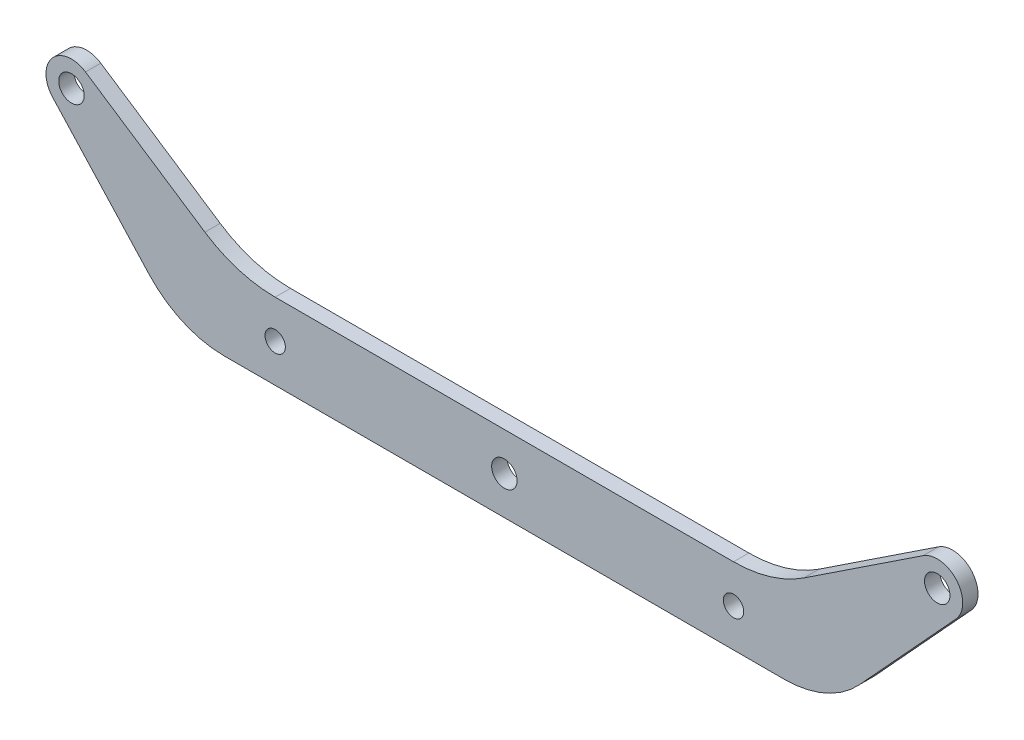
ISO-10303-21;
HEADER;
FILE_DESCRIPTION(('STEP AP214'),'2;1');
FILE_NAME('part.step','',(''),(''),'','','');
FILE_SCHEMA(('AUTOMOTIVE_DESIGN { 1 0 10303 214 1 1 1 1 }'));
ENDSEC;
DATA;
#1=APPLICATION_CONTEXT('core data for automotive mechanical design processes');
#2=APPLICATION_PROTOCOL_DEFINITION('international standard','automotive_design',2000,#1);
#3=PRODUCT_CONTEXT('',#1,'mechanical');
#4=PRODUCT('Part','Part','',(#3));
#5=PRODUCT_RELATED_PRODUCT_CATEGORY('part','',(#4));
#6=PRODUCT_DEFINITION_FORMATION('','',#4);
#7=PRODUCT_DEFINITION_CONTEXT('part definition',#1,'design');
#8=PRODUCT_DEFINITION('design','',#6,#7);
#9=PRODUCT_DEFINITION_SHAPE('','',#8);
#10=(LENGTH_UNIT() NAMED_UNIT(*) SI_UNIT(.MILLI.,.METRE.));
#11=(NAMED_UNIT(*) PLANE_ANGLE_UNIT() SI_UNIT($,.RADIAN.));
#12=(NAMED_UNIT(*) SI_UNIT($,.STERADIAN.) SOLID_ANGLE_UNIT());
#13=UNCERTAINTY_MEASURE_WITH_UNIT(LENGTH_MEASURE(1.E-05),#10,'distance_accuracy_value','');
#14=(GEOMETRIC_REPRESENTATION_CONTEXT(3) GLOBAL_UNCERTAINTY_ASSIGNED_CONTEXT((#13)) GLOBAL_UNIT_ASSIGNED_CONTEXT((#10,
#11,#12)) REPRESENTATION_CONTEXT('',''));
#15=CARTESIAN_POINT('',(0.,0.,0.));
#16=DIRECTION('',(0.,0.,1.));
#17=DIRECTION('',(1.,0.,0.));
#18=AXIS2_PLACEMENT_3D('',#15,#16,#17);
#19=CARTESIAN_POINT('',(23.1358370171919,-34.9528016415682,3.));
#20=DIRECTION('',(0.551954939718657,-0.83387393802671,0.));
#21=DIRECTION('',(0.833873938026711,0.551954939718657,0.));
#22=AXIS2_PLACEMENT_3D('',#19,#20,#21);
#23=PLANE('',#22);
#24=DIRECTION('',(-0.833873938026711,-0.551954939718657,0.));
#25=VECTOR('',#24,1.);
#26=CARTESIAN_POINT('',(23.1358370171919,-34.9528016415682,0.));
#27=LINE('',#26,#25);
#28=CARTESIAN_POINT('',(82.2402253014067,4.16936969013357,0.));
#29=VERTEX_POINT('',#28);
#30=CARTESIAN_POINT('',(58.7988734929664,-11.3468484506678,0.));
#31=VERTEX_POINT('',#30);
#32=EDGE_CURVE('E175',#29,#31,#27,.T.);
#33=ORIENTED_EDGE('',*,*,#32,.T.);
#34=DIRECTION('',(0.,0.,-1.));
#35=VECTOR('',#34,1.);
#36=CARTESIAN_POINT('',(58.7988734929664,-11.3468484506678,3.));
#37=LINE('',#36,#35);
#38=CARTESIAN_POINT('',(58.7988734929664,-11.3468484506678,3.));
#39=VERTEX_POINT('',#38);
#40=EDGE_CURVE('E11',#39,#31,#37,.T.);
#41=ORIENTED_EDGE('',*,*,#40,.F.);
#42=DIRECTION('',(-0.833873938026711,-0.551954939718657,0.));
#43=VECTOR('',#42,1.);
#44=CARTESIAN_POINT('',(23.1358370171919,-34.9528016415682,3.));
#45=LINE('',#44,#43);
#46=CARTESIAN_POINT('',(82.2402253014067,4.16936969013357,3.));
#47=VERTEX_POINT('',#46);
#48=EDGE_CURVE('E219',#47,#39,#45,.T.);
#49=ORIENTED_EDGE('',*,*,#48,.F.);
#50=DIRECTION('',(0.,0.,-1.));
#51=VECTOR('',#50,1.);
#52=CARTESIAN_POINT('',(82.2402253014067,4.16936969013357,3.));
#53=LINE('',#52,#51);
#54=EDGE_CURVE('E55',#47,#29,#53,.T.);
#55=ORIENTED_EDGE('',*,*,#54,.T.);
#56=EDGE_LOOP('',(#33,#41,#49,#55));
#57=FACE_BOUND('',#56,.T.);
#58=ADVANCED_FACE('F39',(#57),#23,.F.);
#59=CARTESIAN_POINT('',(45.,9.50000000000001,3.));
#60=DIRECTION('',(0.,0.,-1.));
#61=DIRECTION('',(-1.,0.,0.));
#62=AXIS2_PLACEMENT_3D('',#59,#60,#61);
#63=CYLINDRICAL_SURFACE('',#62,25.);
#64=CARTESIAN_POINT('',(45.,9.50000000000001,0.));
#65=DIRECTION('',(0.,0.,1.));
#66=DIRECTION('',(1.,0.,0.));
#67=AXIS2_PLACEMENT_3D('',#64,#65,#66);
#68=CIRCLE('',#67,25.);
#69=CARTESIAN_POINT('',(45.,-15.5,0.));
#70=VERTEX_POINT('',#69);
#71=EDGE_CURVE('E177',#31,#70,#68,.F.);
#72=ORIENTED_EDGE('',*,*,#71,.T.);
#73=DIRECTION('',(0.,0.,-1.));
#74=VECTOR('',#73,1.);
#75=CARTESIAN_POINT('',(45.,-15.5,3.));
#76=LINE('',#75,#74);
#77=CARTESIAN_POINT('',(45.,-15.5,3.));
#78=VERTEX_POINT('',#77);
#79=EDGE_CURVE('E47',#78,#70,#76,.T.);
#80=ORIENTED_EDGE('',*,*,#79,.F.);
#81=CARTESIAN_POINT('',(45.,9.50000000000001,3.));
#82=DIRECTION('',(0.,0.,1.));
#83=DIRECTION('',(1.,0.,0.));
#84=AXIS2_PLACEMENT_3D('',#81,#82,#83);
#85=CIRCLE('',#84,25.);
#86=EDGE_CURVE('E105',#39,#78,#85,.F.);
#87=ORIENTED_EDGE('',*,*,#86,.F.);
#88=ORIENTED_EDGE('',*,*,#40,.T.);
#89=EDGE_LOOP('',(#72,#80,#87,#88));
#90=FACE_BOUND('',#89,.T.);
#91=ADVANCED_FACE('F243',(#90),#63,.F.);
#92=CARTESIAN_POINT('',(0.,-15.5,3.));
#93=DIRECTION('',(0.,1.,0.));
#94=DIRECTION('',(-1.,0.,0.));
#95=AXIS2_PLACEMENT_3D('',#92,#93,#94);
#96=PLANE('',#95);
#97=DIRECTION('',(1.,0.,0.));
#98=VECTOR('',#97,1.);
#99=CARTESIAN_POINT('',(0.,-15.5,0.));
#100=LINE('',#99,#98);
#101=CARTESIAN_POINT('',(-45.,-15.5,0.));
#102=VERTEX_POINT('',#101);
#103=EDGE_CURVE('E180',#102,#70,#100,.T.);
#104=ORIENTED_EDGE('',*,*,#103,.F.);
#105=DIRECTION('',(0.,0.,-1.));
#106=VECTOR('',#105,1.);
#107=CARTESIAN_POINT('',(-45.,-15.5,3.));
#108=LINE('',#107,#106);
#109=CARTESIAN_POINT('',(-45.,-15.5,3.));
#110=VERTEX_POINT('',#109);
#111=EDGE_CURVE('E236',#110,#102,#108,.T.);
#112=ORIENTED_EDGE('',*,*,#111,.F.);
#113=DIRECTION('',(1.,0.,0.));
#114=VECTOR('',#113,1.);
#115=CARTESIAN_POINT('',(0.,-15.5,3.));
#116=LINE('',#115,#114);
#117=EDGE_CURVE('E242',#110,#78,#116,.T.);
#118=ORIENTED_EDGE('',*,*,#117,.T.);
#119=ORIENTED_EDGE('',*,*,#79,.T.);
#120=EDGE_LOOP('',(#104,#112,#118,#119));
#121=FACE_BOUND('',#120,.T.);
#122=ADVANCED_FACE('F240',(#121),#96,.T.);
#123=CARTESIAN_POINT('',(-45.,9.49999999999999,3.));
#124=DIRECTION('',(0.,0.,-1.));
#125=DIRECTION('',(-1.,0.,0.));
#126=AXIS2_PLACEMENT_3D('',#123,#124,#125);
#127=CYLINDRICAL_SURFACE('',#126,25.);
#128=CARTESIAN_POINT('',(-45.,9.49999999999999,0.));
#129=DIRECTION('',(0.,0.,1.));
#130=DIRECTION('',(1.,0.,0.));
#131=AXIS2_PLACEMENT_3D('',#128,#129,#130);
#132=CIRCLE('',#131,25.);
#133=CARTESIAN_POINT('',(-58.7988734929664,-11.3468484506678,0.));
#134=VERTEX_POINT('',#133);
#135=EDGE_CURVE('E183',#134,#102,#132,.T.);
#136=ORIENTED_EDGE('',*,*,#135,.F.);
#137=DIRECTION('',(0.,0.,-1.));
#138=VECTOR('',#137,1.);
#139=CARTESIAN_POINT('',(-58.7988734929664,-11.3468484506678,3.));
#140=LINE('',#139,#138);
#141=CARTESIAN_POINT('',(-58.7988734929664,-11.3468484506678,3.));
#142=VERTEX_POINT('',#141);
#143=EDGE_CURVE('E234',#142,#134,#140,.T.);
#144=ORIENTED_EDGE('',*,*,#143,.F.);
#145=CARTESIAN_POINT('',(-45.,9.49999999999999,3.));
#146=DIRECTION('',(0.,0.,1.));
#147=DIRECTION('',(1.,0.,0.));
#148=AXIS2_PLACEMENT_3D('',#145,#146,#147);
#149=CIRCLE('',#148,25.);
#150=EDGE_CURVE('E255',#142,#110,#149,.T.);
#151=ORIENTED_EDGE('',*,*,#150,.T.);
#152=ORIENTED_EDGE('',*,*,#111,.T.);
#153=EDGE_LOOP('',(#136,#144,#151,#152));
#154=FACE_BOUND('',#153,.T.);
#155=ADVANCED_FACE('F252',(#154),#127,.F.);
#156=CARTESIAN_POINT('',(-23.1358370171919,-34.9528016415682,3.));
#157=DIRECTION('',(0.551954939718656,0.833873938026711,0.));
#158=DIRECTION('',(-0.833873938026711,0.551954939718656,0.));
#159=AXIS2_PLACEMENT_3D('',#156,#157,#158);
#160=PLANE('',#159);
#161=DIRECTION('',(0.833873938026711,-0.551954939718656,0.));
#162=VECTOR('',#161,1.);
#163=CARTESIAN_POINT('',(-23.1358370171919,-34.9528016415682,0.));
#164=LINE('',#163,#162);
#165=CARTESIAN_POINT('',(-82.2402253014067,4.16936969013355,0.));
#166=VERTEX_POINT('',#165);
#167=EDGE_CURVE('E186',#166,#134,#164,.T.);
#168=ORIENTED_EDGE('',*,*,#167,.F.);
#169=DIRECTION('',(0.,0.,-1.));
#170=VECTOR('',#169,1.);
#171=CARTESIAN_POINT('',(-82.2402253014067,4.16936969013355,3.));
#172=LINE('',#171,#170);
#173=CARTESIAN_POINT('',(-82.2402253014067,4.16936969013355,3.));
#174=VERTEX_POINT('',#173);
#175=EDGE_CURVE('E232',#174,#166,#172,.T.);
#176=ORIENTED_EDGE('',*,*,#175,.F.);
#177=DIRECTION('',(0.833873938026711,-0.551954939718656,0.));
#178=VECTOR('',#177,1.);
#179=CARTESIAN_POINT('',(-23.1358370171919,-34.9528016415682,3.));
#180=LINE('',#179,#178);
#181=EDGE_CURVE('E259',#174,#142,#180,.T.);
#182=ORIENTED_EDGE('',*,*,#181,.T.);
#183=ORIENTED_EDGE('',*,*,#143,.T.);
#184=EDGE_LOOP('',(#168,#176,#182,#183));
#185=FACE_BOUND('',#184,.T.);
#186=ADVANCED_FACE('F306',(#185),#160,.T.);
#187=CARTESIAN_POINT('',(-85.,0.,3.));
#188=DIRECTION('',(0.,0.,-1.));
#189=DIRECTION('',(-1.,0.,0.));
#190=AXIS2_PLACEMENT_3D('',#187,#188,#189);
#191=CYLINDRICAL_SURFACE('',#190,5.);
#192=CARTESIAN_POINT('',(-85.,0.,0.));
#193=DIRECTION('',(0.,0.,1.));
#194=DIRECTION('',(1.,0.,0.));
#195=AXIS2_PLACEMENT_3D('',#192,#193,#194);
#196=CIRCLE('',#195,5.);
#197=CARTESIAN_POINT('',(-88.683416390266,-3.38118968647425,0.));
#198=VERTEX_POINT('',#197);
#199=EDGE_CURVE('E189',#166,#198,#196,.T.);
#200=ORIENTED_EDGE('',*,*,#199,.T.);
#201=DIRECTION('',(0.,0.,-1.));
#202=VECTOR('',#201,1.);
#203=CARTESIAN_POINT('',(-88.683416390266,-3.38118968647425,3.));
#204=LINE('',#203,#202);
#205=CARTESIAN_POINT('',(-88.683416390266,-3.38118968647425,3.));
#206=VERTEX_POINT('',#205);
#207=EDGE_CURVE('E229',#206,#198,#204,.T.);
#208=ORIENTED_EDGE('',*,*,#207,.F.);
#209=CARTESIAN_POINT('',(-85.,0.,3.));
#210=DIRECTION('',(0.,0.,1.));
#211=DIRECTION('',(1.,0.,0.));
#212=AXIS2_PLACEMENT_3D('',#209,#210,#211);
#213=CIRCLE('',#212,5.);
#214=EDGE_CURVE('E265',#174,#206,#213,.T.);
#215=ORIENTED_EDGE('',*,*,#214,.F.);
#216=ORIENTED_EDGE('',*,*,#175,.T.);
#217=EDGE_LOOP('',(#200,#208,#215,#216));
#218=FACE_BOUND('',#217,.T.);
#219=ADVANCED_FACE('F309',(#218),#191,.T.);
#220=CARTESIAN_POINT('',(-49.8131078241384,-45.7259100196501,3.));
#221=DIRECTION('',(0.736683278053198,0.676237937294851,0.));
#222=DIRECTION('',(-0.676237937294851,0.736683278053198,0.));
#223=AXIS2_PLACEMENT_3D('',#220,#221,#222);
#224=PLANE('',#223);
#225=DIRECTION('',(0.676237937294851,-0.736683278053198,0.));
#226=VECTOR('',#225,1.);
#227=CARTESIAN_POINT('',(-49.8131078241384,-45.7259100196501,0.));
#228=LINE('',#227,#226);
#229=CARTESIAN_POINT('',(-69.7336655610639,-24.024758745897,0.));
#230=VERTEX_POINT('',#229);
#231=EDGE_CURVE('E191',#198,#230,#228,.T.);
#232=ORIENTED_EDGE('',*,*,#231,.T.);
#233=DIRECTION('',(0.,0.,-1.));
#234=VECTOR('',#233,1.);
#235=CARTESIAN_POINT('',(-69.7336655610639,-24.024758745897,3.));
#236=LINE('',#235,#234);
#237=CARTESIAN_POINT('',(-69.7336655610639,-24.024758745897,3.));
#238=VERTEX_POINT('',#237);
#239=EDGE_CURVE('E226',#238,#230,#236,.T.);
#240=ORIENTED_EDGE('',*,*,#239,.F.);
#241=DIRECTION('',(0.676237937294851,-0.736683278053198,0.));
#242=VECTOR('',#241,1.);
#243=CARTESIAN_POINT('',(-49.8131078241384,-45.7259100196501,3.));
#244=LINE('',#243,#242);
#245=EDGE_CURVE('E267',#206,#238,#244,.T.);
#246=ORIENTED_EDGE('',*,*,#245,.F.);
#247=ORIENTED_EDGE('',*,*,#207,.T.);
#248=EDGE_LOOP('',(#232,#240,#246,#247));
#249=FACE_BOUND('',#248,.T.);
#250=ADVANCED_FACE('F313',(#249),#224,.F.);
#251=CARTESIAN_POINT('',(-55.,-10.5,3.));
#252=DIRECTION('',(0.,0.,-1.));
#253=DIRECTION('',(-1.,0.,0.));
#254=AXIS2_PLACEMENT_3D('',#251,#252,#253);
#255=CYLINDRICAL_SURFACE('',#254,20.);
#256=CARTESIAN_POINT('',(-55.,-10.5,0.));
#257=DIRECTION('',(0.,0.,1.));
#258=DIRECTION('',(1.,0.,0.));
#259=AXIS2_PLACEMENT_3D('',#256,#257,#258);
#260=CIRCLE('',#259,20.);
#261=CARTESIAN_POINT('',(-55.,-30.5,0.));
#262=VERTEX_POINT('',#261);
#263=EDGE_CURVE('E193',#230,#262,#260,.T.);
#264=ORIENTED_EDGE('',*,*,#263,.T.);
#265=DIRECTION('',(0.,0.,-1.));
#266=VECTOR('',#265,1.);
#267=CARTESIAN_POINT('',(-55.,-30.5,3.));
#268=LINE('',#267,#266);
#269=CARTESIAN_POINT('',(-55.,-30.5,3.));
#270=VERTEX_POINT('',#269);
#271=EDGE_CURVE('E223',#270,#262,#268,.T.);
#272=ORIENTED_EDGE('',*,*,#271,.F.);
#273=CARTESIAN_POINT('',(-55.,-10.5,3.));
#274=DIRECTION('',(0.,0.,1.));
#275=DIRECTION('',(1.,0.,0.));
#276=AXIS2_PLACEMENT_3D('',#273,#274,#275);
#277=CIRCLE('',#276,20.);
#278=EDGE_CURVE('E269',#238,#270,#277,.T.);
#279=ORIENTED_EDGE('',*,*,#278,.F.);
#280=ORIENTED_EDGE('',*,*,#239,.T.);
#281=EDGE_LOOP('',(#264,#272,#279,#280));
#282=FACE_BOUND('',#281,.T.);
#283=ADVANCED_FACE('F275',(#282),#255,.T.);
#284=CARTESIAN_POINT('',(0.,-30.5,3.));
#285=DIRECTION('',(0.,1.,0.));
#286=DIRECTION('',(0.,0.,1.));
#287=AXIS2_PLACEMENT_3D('',#284,#285,#286);
#288=PLANE('',#287);
#289=DIRECTION('',(1.,0.,0.));
#290=VECTOR('',#289,1.);
#291=CARTESIAN_POINT('',(0.,-30.5,0.));
#292=LINE('',#291,#290);
#293=CARTESIAN_POINT('',(55.,-30.5,0.));
#294=VERTEX_POINT('',#293);
#295=EDGE_CURVE('E195',#262,#294,#292,.T.);
#296=ORIENTED_EDGE('',*,*,#295,.T.);
#297=DIRECTION('',(0.,0.,-1.));
#298=VECTOR('',#297,1.);
#299=CARTESIAN_POINT('',(55.,-30.5,3.));
#300=LINE('',#299,#298);
#301=CARTESIAN_POINT('',(55.,-30.5,3.));
#302=VERTEX_POINT('',#301);
#303=EDGE_CURVE('E142',#302,#294,#300,.T.);
#304=ORIENTED_EDGE('',*,*,#303,.F.);
#305=DIRECTION('',(1.,0.,0.));
#306=VECTOR('',#305,1.);
#307=CARTESIAN_POINT('',(0.,-30.5,3.));
#308=LINE('',#307,#306);
#309=EDGE_CURVE('E151',#270,#302,#308,.T.);
#310=ORIENTED_EDGE('',*,*,#309,.F.);
#311=ORIENTED_EDGE('',*,*,#271,.T.);
#312=EDGE_LOOP('',(#296,#304,#310,#311));
#313=FACE_BOUND('',#312,.T.);
#314=ADVANCED_FACE('F279',(#313),#288,.F.);
#315=CARTESIAN_POINT('',(55.,-10.5,3.));
#316=DIRECTION('',(0.,0.,-1.));
#317=DIRECTION('',(-1.,0.,0.));
#318=AXIS2_PLACEMENT_3D('',#315,#316,#317);
#319=CYLINDRICAL_SURFACE('',#318,20.);
#320=CARTESIAN_POINT('',(55.,-10.5,0.));
#321=DIRECTION('',(0.,0.,1.));
#322=DIRECTION('',(1.,0.,0.));
#323=AXIS2_PLACEMENT_3D('',#320,#321,#322);
#324=CIRCLE('',#323,20.);
#325=CARTESIAN_POINT('',(69.733665561064,-24.024758745897,0.));
#326=VERTEX_POINT('',#325);
#327=EDGE_CURVE('E138',#326,#294,#324,.F.);
#328=ORIENTED_EDGE('',*,*,#327,.F.);
#329=DIRECTION('',(0.,0.,-1.));
#330=VECTOR('',#329,1.);
#331=CARTESIAN_POINT('',(69.733665561064,-24.024758745897,3.));
#332=LINE('',#331,#330);
#333=CARTESIAN_POINT('',(69.733665561064,-24.024758745897,3.));
#334=VERTEX_POINT('',#333);
#335=EDGE_CURVE('E133',#334,#326,#332,.T.);
#336=ORIENTED_EDGE('',*,*,#335,.F.);
#337=CARTESIAN_POINT('',(55.,-10.5,3.));
#338=DIRECTION('',(0.,0.,1.));
#339=DIRECTION('',(1.,0.,0.));
#340=AXIS2_PLACEMENT_3D('',#337,#338,#339);
#341=CIRCLE('',#340,20.);
#342=EDGE_CURVE('E136',#334,#302,#341,.F.);
#343=ORIENTED_EDGE('',*,*,#342,.T.);
#344=ORIENTED_EDGE('',*,*,#303,.T.);
#345=EDGE_LOOP('',(#328,#336,#343,#344));
#346=FACE_BOUND('',#345,.T.);
#347=ADVANCED_FACE('F135',(#346),#319,.T.);
#348=CARTESIAN_POINT('',(49.8131078241385,-45.7259100196501,3.));
#349=DIRECTION('',(0.736683278053198,-0.676237937294851,0.));
#350=DIRECTION('',(0.676237937294851,0.736683278053198,0.));
#351=AXIS2_PLACEMENT_3D('',#348,#349,#350);
#352=PLANE('',#351);
#353=DIRECTION('',(-0.676237937294851,-0.736683278053198,0.));
#354=VECTOR('',#353,1.);
#355=CARTESIAN_POINT('',(49.8131078241385,-45.7259100196501,0.));
#356=LINE('',#355,#354);
#357=CARTESIAN_POINT('',(88.683416390266,-3.38118968647423,0.));
#358=VERTEX_POINT('',#357);
#359=EDGE_CURVE('E199',#358,#326,#356,.T.);
#360=ORIENTED_EDGE('',*,*,#359,.F.);
#361=DIRECTION('',(0.,0.,-1.));
#362=VECTOR('',#361,1.);
#363=CARTESIAN_POINT('',(88.683416390266,-3.38118968647423,3.));
#364=LINE('',#363,#362);
#365=CARTESIAN_POINT('',(88.683416390266,-3.38118968647423,3.));
#366=VERTEX_POINT('',#365);
#367=EDGE_CURVE('E93',#366,#358,#364,.T.);
#368=ORIENTED_EDGE('',*,*,#367,.F.);
#369=DIRECTION('',(-0.676237937294851,-0.736683278053198,0.));
#370=VECTOR('',#369,1.);
#371=CARTESIAN_POINT('',(49.8131078241385,-45.7259100196501,3.));
#372=LINE('',#371,#370);
#373=EDGE_CURVE('E149',#366,#334,#372,.T.);
#374=ORIENTED_EDGE('',*,*,#373,.T.);
#375=ORIENTED_EDGE('',*,*,#335,.T.);
#376=EDGE_LOOP('',(#360,#368,#374,#375));
#377=FACE_BOUND('',#376,.T.);
#378=ADVANCED_FACE('F154',(#377),#352,.T.);
#379=CARTESIAN_POINT('',(-45.,-23.,3.));
#380=DIRECTION('',(0.,0.,-1.));
#381=DIRECTION('',(-1.,0.,0.));
#382=AXIS2_PLACEMENT_3D('',#379,#380,#381);
#383=CYLINDRICAL_SURFACE('',#382,2.);
#384=CARTESIAN_POINT('',(-45.,-23.,3.));
#385=DIRECTION('',(0.,0.,1.));
#386=DIRECTION('',(1.,0.,0.));
#387=AXIS2_PLACEMENT_3D('',#384,#385,#386);
#388=CIRCLE('',#387,2.);
#389=CARTESIAN_POINT('',(-43.,-23.,3.));
#390=VERTEX_POINT('',#389);
#391=EDGE_CURVE('E169',#390,#390,#388,.T.);
#392=ORIENTED_EDGE('',*,*,#391,.T.);
#393=EDGE_LOOP('',(#392));
#394=FACE_BOUND('',#393,.T.);
#395=CARTESIAN_POINT('',(-45.,-23.,0.));
#396=DIRECTION('',(0.,0.,1.));
#397=DIRECTION('',(1.,0.,0.));
#398=AXIS2_PLACEMENT_3D('',#395,#396,#397);
#399=CIRCLE('',#398,2.);
#400=CARTESIAN_POINT('',(-43.,-23.,0.));
#401=VERTEX_POINT('',#400);
#402=EDGE_CURVE('E213',#401,#401,#399,.T.);
#403=ORIENTED_EDGE('',*,*,#402,.F.);
#404=EDGE_LOOP('',(#403));
#405=FACE_BOUND('',#404,.T.);
#406=ADVANCED_FACE('F324',(#394,#405),#383,.F.);
#407=CARTESIAN_POINT('',(0.,-23.,3.));
#408=DIRECTION('',(0.,0.,-1.));
#409=DIRECTION('',(-1.,0.,0.));
#410=AXIS2_PLACEMENT_3D('',#407,#408,#409);
#411=CYLINDRICAL_SURFACE('',#410,2.5);
#412=CARTESIAN_POINT('',(0.,-23.,3.));
#413=DIRECTION('',(0.,0.,1.));
#414=DIRECTION('',(1.,0.,0.));
#415=AXIS2_PLACEMENT_3D('',#412,#413,#414);
#416=CIRCLE('',#415,2.5);
#417=CARTESIAN_POINT('',(2.50000000000001,-23.,3.));
#418=VERTEX_POINT('',#417);
#419=EDGE_CURVE('E166',#418,#418,#416,.T.);
#420=ORIENTED_EDGE('',*,*,#419,.T.);
#421=EDGE_LOOP('',(#420));
#422=FACE_BOUND('',#421,.T.);
#423=CARTESIAN_POINT('',(0.,-23.,0.));
#424=DIRECTION('',(0.,0.,1.));
#425=DIRECTION('',(1.,0.,0.));
#426=AXIS2_PLACEMENT_3D('',#423,#424,#425);
#427=CIRCLE('',#426,2.5);
#428=CARTESIAN_POINT('',(2.50000000000001,-23.,0.));
#429=VERTEX_POINT('',#428);
#430=EDGE_CURVE('E210',#429,#429,#427,.T.);
#431=ORIENTED_EDGE('',*,*,#430,.F.);
#432=EDGE_LOOP('',(#431));
#433=FACE_BOUND('',#432,.T.);
#434=ADVANCED_FACE('F328',(#422,#433),#411,.F.);
#435=CARTESIAN_POINT('',(85.,0.,3.));
#436=DIRECTION('',(0.,0.,-1.));
#437=DIRECTION('',(-1.,0.,0.));
#438=AXIS2_PLACEMENT_3D('',#435,#436,#437);
#439=CYLINDRICAL_SURFACE('',#438,2.50000000000001);
#440=CARTESIAN_POINT('',(85.,0.,3.));
#441=DIRECTION('',(0.,0.,1.));
#442=DIRECTION('',(1.,0.,0.));
#443=AXIS2_PLACEMENT_3D('',#440,#441,#442);
#444=CIRCLE('',#443,2.50000000000001);
#445=CARTESIAN_POINT('',(87.5,0.,3.));
#446=VERTEX_POINT('',#445);
#447=EDGE_CURVE('E163',#446,#446,#444,.F.);
#448=ORIENTED_EDGE('',*,*,#447,.F.);
#449=EDGE_LOOP('',(#448));
#450=FACE_BOUND('',#449,.T.);
#451=CARTESIAN_POINT('',(85.,0.,0.));
#452=DIRECTION('',(0.,0.,1.));
#453=DIRECTION('',(1.,0.,0.));
#454=AXIS2_PLACEMENT_3D('',#451,#452,#453);
#455=CIRCLE('',#454,2.50000000000001);
#456=CARTESIAN_POINT('',(87.5,0.,0.));
#457=VERTEX_POINT('',#456);
#458=EDGE_CURVE('E207',#457,#457,#455,.F.);
#459=ORIENTED_EDGE('',*,*,#458,.T.);
#460=EDGE_LOOP('',(#459));
#461=FACE_BOUND('',#460,.T.);
#462=ADVANCED_FACE('F291',(#450,#461),#439,.F.);
#463=CARTESIAN_POINT('',(-85.,0.,3.));
#464=DIRECTION('',(0.,0.,-1.));
#465=DIRECTION('',(-1.,0.,0.));
#466=AXIS2_PLACEMENT_3D('',#463,#464,#465);
#467=CYLINDRICAL_SURFACE('',#466,2.50000000000001);
#468=CARTESIAN_POINT('',(-85.,0.,3.));
#469=DIRECTION('',(0.,0.,1.));
#470=DIRECTION('',(1.,0.,0.));
#471=AXIS2_PLACEMENT_3D('',#468,#469,#470);
#472=CIRCLE('',#471,2.50000000000001);
#473=CARTESIAN_POINT('',(-82.5,0.,3.));
#474=VERTEX_POINT('',#473);
#475=EDGE_CURVE('E157',#474,#474,#472,.T.);
#476=ORIENTED_EDGE('',*,*,#475,.T.);
#477=EDGE_LOOP('',(#476));
#478=FACE_BOUND('',#477,.T.);
#479=CARTESIAN_POINT('',(-85.,0.,0.));
#480=DIRECTION('',(0.,0.,1.));
#481=DIRECTION('',(1.,0.,0.));
#482=AXIS2_PLACEMENT_3D('',#479,#480,#481);
#483=CIRCLE('',#482,2.50000000000001);
#484=CARTESIAN_POINT('',(-82.5,0.,0.));
#485=VERTEX_POINT('',#484);
#486=EDGE_CURVE('E204',#485,#485,#483,.T.);
#487=ORIENTED_EDGE('',*,*,#486,.F.);
#488=EDGE_LOOP('',(#487));
#489=FACE_BOUND('',#488,.T.);
#490=ADVANCED_FACE('F283',(#478,#489),#467,.F.);
#491=CARTESIAN_POINT('',(85.,0.,3.));
#492=DIRECTION('',(0.,0.,-1.));
#493=DIRECTION('',(-1.,0.,0.));
#494=AXIS2_PLACEMENT_3D('',#491,#492,#493);
#495=CYLINDRICAL_SURFACE('',#494,5.00000000000001);
#496=CARTESIAN_POINT('',(85.,0.,0.));
#497=DIRECTION('',(0.,0.,1.));
#498=DIRECTION('',(1.,0.,0.));
#499=AXIS2_PLACEMENT_3D('',#496,#497,#498);
#500=CIRCLE('',#499,5.00000000000001);
#501=EDGE_CURVE('E201',#29,#358,#500,.F.);
#502=ORIENTED_EDGE('',*,*,#501,.F.);
#503=ORIENTED_EDGE('',*,*,#54,.F.);
#504=CARTESIAN_POINT('',(85.,0.,3.));
#505=DIRECTION('',(0.,0.,1.));
#506=DIRECTION('',(1.,0.,0.));
#507=AXIS2_PLACEMENT_3D('',#504,#505,#506);
#508=CIRCLE('',#507,5.00000000000001);
#509=EDGE_CURVE('E155',#47,#366,#508,.F.);
#510=ORIENTED_EDGE('',*,*,#509,.T.);
#511=ORIENTED_EDGE('',*,*,#367,.T.);
#512=EDGE_LOOP('',(#502,#503,#510,#511));
#513=FACE_BOUND('',#512,.T.);
#514=ADVANCED_FACE('F280',(#513),#495,.T.);
#515=CARTESIAN_POINT('',(45.,-23.,3.));
#516=DIRECTION('',(0.,0.,-1.));
#517=DIRECTION('',(-1.,0.,0.));
#518=AXIS2_PLACEMENT_3D('',#515,#516,#517);
#519=CYLINDRICAL_SURFACE('',#518,2.);
#520=CARTESIAN_POINT('',(45.,-23.,3.));
#521=DIRECTION('',(0.,0.,1.));
#522=DIRECTION('',(1.,0.,0.));
#523=AXIS2_PLACEMENT_3D('',#520,#521,#522);
#524=CIRCLE('',#523,2.);
#525=CARTESIAN_POINT('',(47.,-23.,3.));
#526=VERTEX_POINT('',#525);
#527=EDGE_CURVE('E172',#526,#526,#524,.F.);
#528=ORIENTED_EDGE('',*,*,#527,.F.);
#529=EDGE_LOOP('',(#528));
#530=FACE_BOUND('',#529,.T.);
#531=CARTESIAN_POINT('',(45.,-23.,0.));
#532=DIRECTION('',(0.,0.,1.));
#533=DIRECTION('',(1.,0.,0.));
#534=AXIS2_PLACEMENT_3D('',#531,#532,#533);
#535=CIRCLE('',#534,2.);
#536=CARTESIAN_POINT('',(47.,-23.,0.));
#537=VERTEX_POINT('',#536);
#538=EDGE_CURVE('E216',#537,#537,#535,.F.);
#539=ORIENTED_EDGE('',*,*,#538,.T.);
#540=EDGE_LOOP('',(#539));
#541=FACE_BOUND('',#540,.T.);
#542=ADVANCED_FACE('F282',(#530,#541),#519,.F.);
#543=CARTESIAN_POINT('',(0.,0.,3.));
#544=DIRECTION('',(0.,0.,1.));
#545=DIRECTION('',(1.,0.,0.));
#546=AXIS2_PLACEMENT_3D('',#543,#544,#545);
#547=PLANE('',#546);
#548=ORIENTED_EDGE('',*,*,#48,.T.);
#549=ORIENTED_EDGE('',*,*,#86,.T.);
#550=ORIENTED_EDGE('',*,*,#117,.F.);
#551=ORIENTED_EDGE('',*,*,#150,.F.);
#552=ORIENTED_EDGE('',*,*,#181,.F.);
#553=ORIENTED_EDGE('',*,*,#214,.T.);
#554=ORIENTED_EDGE('',*,*,#245,.T.);
#555=ORIENTED_EDGE('',*,*,#278,.T.);
#556=ORIENTED_EDGE('',*,*,#309,.T.);
#557=ORIENTED_EDGE('',*,*,#342,.F.);
#558=ORIENTED_EDGE('',*,*,#373,.F.);
#559=ORIENTED_EDGE('',*,*,#509,.F.);
#560=EDGE_LOOP('',(#548,#549,#550,#551,#552,#553,#554,#555,#556,#557,#558,#559));
#561=FACE_BOUND('',#560,.T.);
#562=ORIENTED_EDGE('',*,*,#475,.F.);
#563=EDGE_LOOP('',(#562));
#564=FACE_BOUND('',#563,.T.);
#565=ORIENTED_EDGE('',*,*,#447,.T.);
#566=EDGE_LOOP('',(#565));
#567=FACE_BOUND('',#566,.T.);
#568=ORIENTED_EDGE('',*,*,#419,.F.);
#569=EDGE_LOOP('',(#568));
#570=FACE_BOUND('',#569,.T.);
#571=ORIENTED_EDGE('',*,*,#391,.F.);
#572=EDGE_LOOP('',(#571));
#573=FACE_BOUND('',#572,.T.);
#574=ORIENTED_EDGE('',*,*,#527,.T.);
#575=EDGE_LOOP('',(#574));
#576=FACE_BOUND('',#575,.T.);
#577=ADVANCED_FACE('F146',(#561,#564,#567,#570,#573,#576),#547,.T.);
#578=CARTESIAN_POINT('',(0.,0.,0.));
#579=DIRECTION('',(0.,0.,1.));
#580=DIRECTION('',(1.,0.,0.));
#581=AXIS2_PLACEMENT_3D('',#578,#579,#580);
#582=PLANE('',#581);
#583=ORIENTED_EDGE('',*,*,#32,.F.);
#584=ORIENTED_EDGE('',*,*,#501,.T.);
#585=ORIENTED_EDGE('',*,*,#359,.T.);
#586=ORIENTED_EDGE('',*,*,#327,.T.);
#587=ORIENTED_EDGE('',*,*,#295,.F.);
#588=ORIENTED_EDGE('',*,*,#263,.F.);
#589=ORIENTED_EDGE('',*,*,#231,.F.);
#590=ORIENTED_EDGE('',*,*,#199,.F.);
#591=ORIENTED_EDGE('',*,*,#167,.T.);
#592=ORIENTED_EDGE('',*,*,#135,.T.);
#593=ORIENTED_EDGE('',*,*,#103,.T.);
#594=ORIENTED_EDGE('',*,*,#71,.F.);
#595=EDGE_LOOP('',(#583,#584,#585,#586,#587,#588,#589,#590,#591,#592,#593,#594));
#596=FACE_BOUND('',#595,.T.);
#597=ORIENTED_EDGE('',*,*,#486,.T.);
#598=EDGE_LOOP('',(#597));
#599=FACE_BOUND('',#598,.T.);
#600=ORIENTED_EDGE('',*,*,#458,.F.);
#601=EDGE_LOOP('',(#600));
#602=FACE_BOUND('',#601,.T.);
#603=ORIENTED_EDGE('',*,*,#430,.T.);
#604=EDGE_LOOP('',(#603));
#605=FACE_BOUND('',#604,.T.);
#606=ORIENTED_EDGE('',*,*,#402,.T.);
#607=EDGE_LOOP('',(#606));
#608=FACE_BOUND('',#607,.T.);
#609=ORIENTED_EDGE('',*,*,#538,.F.);
#610=EDGE_LOOP('',(#609));
#611=FACE_BOUND('',#610,.T.);
#612=ADVANCED_FACE('F246',(#596,#599,#602,#605,#608,#611),#582,.F.);
#613=CLOSED_SHELL('',(#58,#91,#122,#155,#186,#219,#250,#283,#314,#347,#378,#406,#434,#462,#490,
#514,#542,#577,#612));
#614=MANIFOLD_SOLID_BREP('B2',#613);
#615=ADVANCED_BREP_SHAPE_REPRESENTATION('',(#18,#614),#14);
#616=SHAPE_DEFINITION_REPRESENTATION(#9,#615);
ENDSEC;
END-ISO-10303-21;
